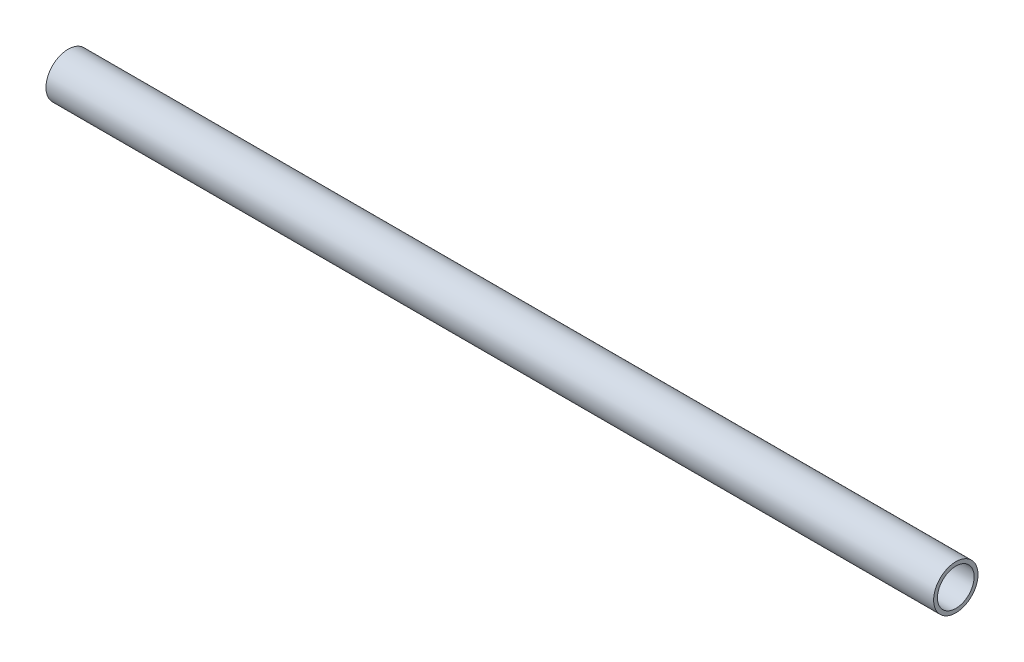
ISO-10303-21;
HEADER;
FILE_DESCRIPTION(('STEP AP214'),'2;1');
FILE_NAME('part.step','',(''),(''),'','','');
FILE_SCHEMA(('AUTOMOTIVE_DESIGN { 1 0 10303 214 1 1 1 1 }'));
ENDSEC;
DATA;
#1=APPLICATION_CONTEXT('core data for automotive mechanical design processes');
#2=APPLICATION_PROTOCOL_DEFINITION('international standard','automotive_design',2000,#1);
#3=PRODUCT_CONTEXT('',#1,'mechanical');
#4=PRODUCT('Part','Part','',(#3));
#5=PRODUCT_RELATED_PRODUCT_CATEGORY('part','',(#4));
#6=PRODUCT_DEFINITION_FORMATION('','',#4);
#7=PRODUCT_DEFINITION_CONTEXT('part definition',#1,'design');
#8=PRODUCT_DEFINITION('design','',#6,#7);
#9=PRODUCT_DEFINITION_SHAPE('','',#8);
#10=(LENGTH_UNIT() NAMED_UNIT(*) SI_UNIT(.MILLI.,.METRE.));
#11=(NAMED_UNIT(*) PLANE_ANGLE_UNIT() SI_UNIT($,.RADIAN.));
#12=(NAMED_UNIT(*) SI_UNIT($,.STERADIAN.) SOLID_ANGLE_UNIT());
#13=UNCERTAINTY_MEASURE_WITH_UNIT(LENGTH_MEASURE(1.E-05),#10,'distance_accuracy_value','');
#14=(GEOMETRIC_REPRESENTATION_CONTEXT(3) GLOBAL_UNCERTAINTY_ASSIGNED_CONTEXT((#13)) GLOBAL_UNIT_ASSIGNED_CONTEXT((#10,
#11,#12)) REPRESENTATION_CONTEXT('',''));
#15=CARTESIAN_POINT('',(0.,0.,0.));
#16=DIRECTION('',(0.,0.,1.));
#17=DIRECTION('',(1.,0.,0.));
#18=AXIS2_PLACEMENT_3D('',#15,#16,#17);
#19=CARTESIAN_POINT('',(0.,0.,0.));
#20=DIRECTION('',(1.,0.,0.));
#21=DIRECTION('',(0.,0.,-1.));
#22=AXIS2_PLACEMENT_3D('',#19,#20,#21);
#23=PLANE('',#22);
#24=CARTESIAN_POINT('',(0.,0.,0.));
#25=DIRECTION('',(1.,0.,0.));
#26=DIRECTION('',(0.,0.,-1.));
#27=AXIS2_PLACEMENT_3D('',#24,#25,#26);
#28=CIRCLE('',#27,7.874);
#29=CARTESIAN_POINT('',(0.,0.,-7.874));
#30=VERTEX_POINT('',#29);
#31=EDGE_CURVE('E59',#30,#30,#28,.F.);
#32=ORIENTED_EDGE('',*,*,#31,.F.);
#33=EDGE_LOOP('',(#32));
#34=FACE_BOUND('',#33,.T.);
#35=CARTESIAN_POINT('',(0.,0.,0.));
#36=DIRECTION('',(1.,0.,0.));
#37=DIRECTION('',(0.,0.,-1.));
#38=AXIS2_PLACEMENT_3D('',#35,#36,#37);
#39=CIRCLE('',#38,9.525);
#40=CARTESIAN_POINT('',(0.,0.,-9.525));
#41=VERTEX_POINT('',#40);
#42=EDGE_CURVE('E51',#41,#41,#39,.T.);
#43=ORIENTED_EDGE('',*,*,#42,.F.);
#44=EDGE_LOOP('',(#43));
#45=FACE_BOUND('',#44,.T.);
#46=ADVANCED_FACE('F45',(#34,#45),#23,.F.);
#47=CARTESIAN_POINT('',(381.,0.,0.));
#48=DIRECTION('',(1.,0.,0.));
#49=DIRECTION('',(0.,0.,-1.));
#50=AXIS2_PLACEMENT_3D('',#47,#48,#49);
#51=PLANE('',#50);
#52=CARTESIAN_POINT('',(381.,0.,0.));
#53=DIRECTION('',(1.,0.,0.));
#54=DIRECTION('',(0.,0.,-1.));
#55=AXIS2_PLACEMENT_3D('',#52,#53,#54);
#56=CIRCLE('',#55,7.874);
#57=CARTESIAN_POINT('',(381.,0.,-7.874));
#58=VERTEX_POINT('',#57);
#59=EDGE_CURVE('E55',#58,#58,#56,.F.);
#60=ORIENTED_EDGE('',*,*,#59,.T.);
#61=EDGE_LOOP('',(#60));
#62=FACE_BOUND('',#61,.T.);
#63=CARTESIAN_POINT('',(381.,0.,0.));
#64=DIRECTION('',(1.,0.,0.));
#65=DIRECTION('',(0.,0.,-1.));
#66=AXIS2_PLACEMENT_3D('',#63,#64,#65);
#67=CIRCLE('',#66,9.525);
#68=CARTESIAN_POINT('',(381.,0.,-9.525));
#69=VERTEX_POINT('',#68);
#70=EDGE_CURVE('E11',#69,#69,#67,.T.);
#71=ORIENTED_EDGE('',*,*,#70,.T.);
#72=EDGE_LOOP('',(#71));
#73=FACE_BOUND('',#72,.T.);
#74=ADVANCED_FACE('F70',(#62,#73),#51,.T.);
#75=CARTESIAN_POINT('',(0.,0.,0.));
#76=DIRECTION('',(1.,0.,0.));
#77=DIRECTION('',(0.,0.,-1.));
#78=AXIS2_PLACEMENT_3D('',#75,#76,#77);
#79=CYLINDRICAL_SURFACE('',#78,9.525);
#80=ORIENTED_EDGE('',*,*,#70,.F.);
#81=EDGE_LOOP('',(#80));
#82=FACE_BOUND('',#81,.T.);
#83=ORIENTED_EDGE('',*,*,#42,.T.);
#84=EDGE_LOOP('',(#83));
#85=FACE_BOUND('',#84,.T.);
#86=ADVANCED_FACE('F74',(#82,#85),#79,.T.);
#87=CARTESIAN_POINT('',(-3.81000000000001,0.,0.));
#88=DIRECTION('',(1.,0.,0.));
#89=DIRECTION('',(0.,0.,-1.));
#90=AXIS2_PLACEMENT_3D('',#87,#88,#89);
#91=CYLINDRICAL_SURFACE('',#90,7.874);
#92=ORIENTED_EDGE('',*,*,#31,.T.);
#93=EDGE_LOOP('',(#92));
#94=FACE_BOUND('',#93,.T.);
#95=ORIENTED_EDGE('',*,*,#59,.F.);
#96=EDGE_LOOP('',(#95));
#97=FACE_BOUND('',#96,.T.);
#98=ADVANCED_FACE('F65',(#94,#97),#91,.F.);
#99=CLOSED_SHELL('',(#46,#74,#86,#98));
#100=MANIFOLD_SOLID_BREP('B2',#99);
#101=ADVANCED_BREP_SHAPE_REPRESENTATION('',(#18,#100),#14);
#102=SHAPE_DEFINITION_REPRESENTATION(#9,#101);
ENDSEC;
END-ISO-10303-21;
